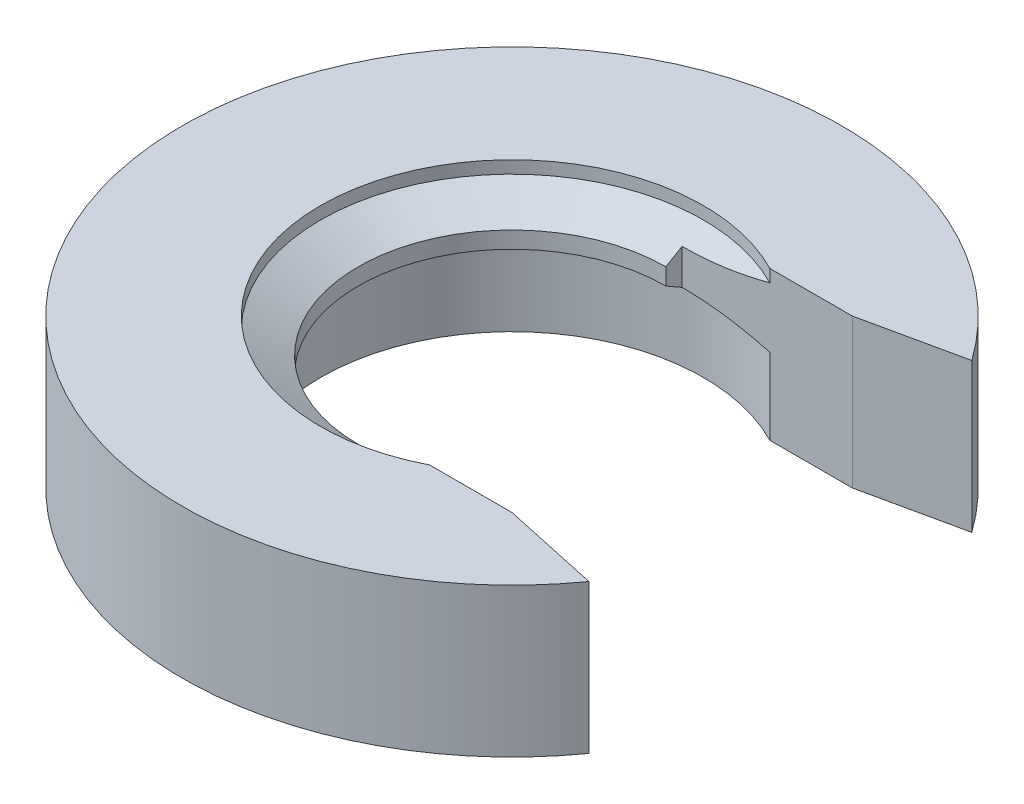
ISO-10303-21;
HEADER;
FILE_DESCRIPTION(('STEP AP214'),'2;1');
FILE_NAME('part.step','',(''),(''),'','','');
FILE_SCHEMA(('AUTOMOTIVE_DESIGN { 1 0 10303 214 1 1 1 1 }'));
ENDSEC;
DATA;
#1=APPLICATION_CONTEXT('core data for automotive mechanical design processes');
#2=APPLICATION_PROTOCOL_DEFINITION('international standard','automotive_design',2000,#1);
#3=PRODUCT_CONTEXT('',#1,'mechanical');
#4=PRODUCT('Part','Part','',(#3));
#5=PRODUCT_RELATED_PRODUCT_CATEGORY('part','',(#4));
#6=PRODUCT_DEFINITION_FORMATION('','',#4);
#7=PRODUCT_DEFINITION_CONTEXT('part definition',#1,'design');
#8=PRODUCT_DEFINITION('design','',#6,#7);
#9=PRODUCT_DEFINITION_SHAPE('','',#8);
#10=(LENGTH_UNIT() NAMED_UNIT(*) SI_UNIT(.MILLI.,.METRE.));
#11=(NAMED_UNIT(*) PLANE_ANGLE_UNIT() SI_UNIT($,.RADIAN.));
#12=(NAMED_UNIT(*) SI_UNIT($,.STERADIAN.) SOLID_ANGLE_UNIT());
#13=UNCERTAINTY_MEASURE_WITH_UNIT(LENGTH_MEASURE(1.E-05),#10,'distance_accuracy_value','');
#14=(GEOMETRIC_REPRESENTATION_CONTEXT(3) GLOBAL_UNCERTAINTY_ASSIGNED_CONTEXT((#13)) GLOBAL_UNIT_ASSIGNED_CONTEXT((#10,
#11,#12)) REPRESENTATION_CONTEXT('',''));
#15=CARTESIAN_POINT('',(0.,0.,0.));
#16=DIRECTION('',(0.,0.,1.));
#17=DIRECTION('',(1.,0.,0.));
#18=AXIS2_PLACEMENT_3D('',#15,#16,#17);
#19=CARTESIAN_POINT('',(0.,10.7834936490571,0.));
#20=DIRECTION('',(0.,1.,0.));
#21=DIRECTION('',(0.,0.,1.));
#22=AXIS2_PLACEMENT_3D('',#19,#20,#21);
#23=CONICAL_SURFACE('',#22,14.4599364905361,1.0471975512);
#24=CARTESIAN_POINT('',(0.,12.8273502691784,0.));
#25=DIRECTION('',(0.,1.,0.));
#26=DIRECTION('',(0.,0.,1.));
#27=AXIS2_PLACEMENT_3D('',#24,#25,#26);
#28=CIRCLE('',#27,18.);
#29=CARTESIAN_POINT('',(8.24621125123533,12.8273502691784,-16.));
#30=VERTEX_POINT('',#29);
#31=CARTESIAN_POINT('',(8.24621125123533,12.8273502691784,16.));
#32=VERTEX_POINT('',#31);
#33=EDGE_CURVE('E158',#30,#32,#28,.T.);
#34=ORIENTED_EDGE('',*,*,#33,.T.);
#35=CARTESIAN_POINT('',(16.7421366401361,15.8053999350849,16.));
#36=CARTESIAN_POINT('',(16.4627198823699,15.6887763855558,16.));
#37=CARTESIAN_POINT('',(16.1828108383827,15.5733336148567,16.));
#38=CARTESIAN_POINT('',(15.6219242010452,15.3450532160892,16.));
#39=CARTESIAN_POINT('',(15.3409465794902,15.2322156573481,16.));
#40=CARTESIAN_POINT('',(14.4961292949801,14.8979150154769,16.));
#41=CARTESIAN_POINT('',(13.9305816734897,14.6807379712502,16.));
#42=CARTESIAN_POINT('',(12.790461278415,14.2587949668925,16.));
#43=CARTESIAN_POINT('',(12.2158532436138,14.0541239245055,16.));
#44=CARTESIAN_POINT('',(11.0608545244695,13.6618646182301,16.));
#45=CARTESIAN_POINT('',(10.4804643527188,13.4742748547585,16.));
#46=CARTESIAN_POINT('',(9.33604492082407,13.1266977182521,16.));
#47=CARTESIAN_POINT('',(8.7722570617951,12.9659206609901,16.));
#48=CARTESIAN_POINT('',(7.63857975493947,12.6672428961332,16.));
#49=CARTESIAN_POINT('',(7.068690116693,12.5293429046971,16.));
#50=CARTESIAN_POINT('',(5.92460230295365,12.2808720224436,16.));
#51=CARTESIAN_POINT('',(5.3504207345792,12.1702254249366,16.));
#52=CARTESIAN_POINT('',(4.19694402244623,11.9798392617871,16.));
#53=CARTESIAN_POINT('',(3.61764949373249,11.9000960291958,16.));
#54=CARTESIAN_POINT('',(2.56136850476196,11.7863836888489,16.));
#55=CARTESIAN_POINT('',(2.08499426921042,11.7467183842786,16.));
#56=CARTESIAN_POINT('',(1.13083592825923,11.691638975909,16.));
#57=CARTESIAN_POINT('',(0.653051859030117,11.6762242552671,16.));
#58=CARTESIAN_POINT('',(-0.303367619513315,11.6701782602402,16.));
#59=CARTESIAN_POINT('',(-0.782003257074148,11.6795830309927,16.));
#60=CARTESIAN_POINT('',(-1.73813967029982,11.7229219458234,16.));
#61=CARTESIAN_POINT('',(-2.21564047087646,11.7568555463637,16.));
#62=CARTESIAN_POINT('',(-3.18291032751171,11.8495115438511,16.));
#63=CARTESIAN_POINT('',(-3.67260938659761,11.908958410317,16.));
#64=CARTESIAN_POINT('',(-4.64873226851278,12.0507869381823,16.));
#65=CARTESIAN_POINT('',(-5.13515549906461,12.1331726386966,16.));
#66=CARTESIAN_POINT('',(-6.10322828511637,12.3183828275526,16.));
#67=CARTESIAN_POINT('',(-6.58488432660522,12.4211737994681,16.));
#68=CARTESIAN_POINT('',(-7.5437381180417,12.644774479305,16.));
#69=CARTESIAN_POINT('',(-8.02093812194409,12.7655744872879,16.));
#70=CARTESIAN_POINT('',(-8.4959253889008,12.8941841425082,16.));
#71=B_SPLINE_CURVE_WITH_KNOTS('',3,(#35,#36,#37,#38,#39,#40,#41,#42,#43,#44,#45,#46,#47,#48,#49,
#50,#51,#52,#53,#54,#55,#56,#57,#58,#59,#60,#61,#62,#63,#64,#65,#66,#67,#68,#69,#70),
.UNSPECIFIED.,.F.,.F.,(4,2,2,2,2,2,2,2,2,2,2,2,2,2,2,2,2,4),(0.,0.908330237140723,
1.81668461807974,3.63396733698278,5.46366433855456,7.2932005539671,9.05159397345678,
10.8100424284614,12.5635495910544,14.3168486212546,15.7503422664533,17.1837994484388,
18.6193395734111,20.0548478890144,21.5341378156514,23.0136883834738,24.490828547721,
25.9671759573711),.UNSPECIFIED.);
#72=CARTESIAN_POINT('',(0.,11.6726497308082,16.));
#73=VERTEX_POINT('',#72);
#74=EDGE_CURVE('E54',#32,#73,#71,.T.);
#75=ORIENTED_EDGE('',*,*,#74,.T.);
#76=DIRECTION('',(0.,-0.499999999997051,-0.866025403786141));
#77=VECTOR('',#76,1.);
#78=CARTESIAN_POINT('',(0.,2.43504542384683,0.));
#79=LINE('',#78,#77);
#80=CARTESIAN_POINT('',(0.,10.7834936490571,14.4599364905361));
#81=VERTEX_POINT('',#80);
#82=EDGE_CURVE('E214',#73,#81,#79,.T.);
#83=ORIENTED_EDGE('',*,*,#82,.T.);
#84=CARTESIAN_POINT('',(0.,10.7834936490571,0.));
#85=DIRECTION('',(0.,1.,0.));
#86=DIRECTION('',(0.,0.,1.));
#87=AXIS2_PLACEMENT_3D('',#84,#85,#86);
#88=CIRCLE('',#87,14.4599364905361);
#89=CARTESIAN_POINT('',(0.,10.7834936490571,-14.4599364905361));
#90=VERTEX_POINT('',#89);
#91=EDGE_CURVE('E149',#90,#81,#88,.T.);
#92=ORIENTED_EDGE('',*,*,#91,.F.);
#93=DIRECTION('',(0.,-0.499999999997051,0.866025403786141));
#94=VECTOR('',#93,1.);
#95=CARTESIAN_POINT('',(0.,2.43504542384683,0.));
#96=LINE('',#95,#94);
#97=CARTESIAN_POINT('',(0.,11.6726497308082,-16.));
#98=VERTEX_POINT('',#97);
#99=EDGE_CURVE('E195',#98,#90,#96,.T.);
#100=ORIENTED_EDGE('',*,*,#99,.F.);
#101=CARTESIAN_POINT('',(16.7421366401361,15.8053999350849,-16.));
#102=CARTESIAN_POINT('',(16.4627198823699,15.6887763855558,-16.));
#103=CARTESIAN_POINT('',(16.1828108383827,15.5733336148567,-16.));
#104=CARTESIAN_POINT('',(15.6219242010452,15.3450532160892,-16.));
#105=CARTESIAN_POINT('',(15.3409465794902,15.2322156573481,-16.));
#106=CARTESIAN_POINT('',(14.4961292949801,14.8979150154769,-16.));
#107=CARTESIAN_POINT('',(13.9305816734897,14.6807379712502,-16.));
#108=CARTESIAN_POINT('',(12.790461278415,14.2587949668925,-16.));
#109=CARTESIAN_POINT('',(12.2158532436138,14.0541239245055,-16.));
#110=CARTESIAN_POINT('',(11.0608545244695,13.6618646182301,-16.));
#111=CARTESIAN_POINT('',(10.4804643527188,13.4742748547585,-16.));
#112=CARTESIAN_POINT('',(9.33604492082407,13.1266977182521,-16.));
#113=CARTESIAN_POINT('',(8.7722570617951,12.9659206609901,-16.));
#114=CARTESIAN_POINT('',(7.63857975493947,12.6672428961332,-16.));
#115=CARTESIAN_POINT('',(7.068690116693,12.5293429046971,-16.));
#116=CARTESIAN_POINT('',(5.92460230295365,12.2808720224436,-16.));
#117=CARTESIAN_POINT('',(5.3504207345792,12.1702254249366,-16.));
#118=CARTESIAN_POINT('',(4.19694402244623,11.9798392617871,-16.));
#119=CARTESIAN_POINT('',(3.61764949373249,11.9000960291958,-16.));
#120=CARTESIAN_POINT('',(2.56136850476196,11.7863836888489,-16.));
#121=CARTESIAN_POINT('',(2.08499426921042,11.7467183842786,-16.));
#122=CARTESIAN_POINT('',(1.13083592825923,11.691638975909,-16.));
#123=CARTESIAN_POINT('',(0.653051859030117,11.6762242552671,-16.));
#124=CARTESIAN_POINT('',(-0.303367619513315,11.6701782602402,-16.));
#125=CARTESIAN_POINT('',(-0.782003257074148,11.6795830309927,-16.));
#126=CARTESIAN_POINT('',(-1.73813967029982,11.7229219458234,-16.));
#127=CARTESIAN_POINT('',(-2.21564047087646,11.7568555463637,-16.));
#128=CARTESIAN_POINT('',(-3.18291032751171,11.8495115438511,-16.));
#129=CARTESIAN_POINT('',(-3.67260938659761,11.908958410317,-16.));
#130=CARTESIAN_POINT('',(-4.64873226851278,12.0507869381823,-16.));
#131=CARTESIAN_POINT('',(-5.13515549906461,12.1331726386966,-16.));
#132=CARTESIAN_POINT('',(-6.10322828511637,12.3183828275526,-16.));
#133=CARTESIAN_POINT('',(-6.58488432660522,12.4211737994681,-16.));
#134=CARTESIAN_POINT('',(-7.5437381180417,12.644774479305,-16.));
#135=CARTESIAN_POINT('',(-8.02093812194409,12.7655744872879,-16.));
#136=CARTESIAN_POINT('',(-8.4959253889008,12.8941841425082,-16.));
#137=B_SPLINE_CURVE_WITH_KNOTS('',3,(#101,#102,#103,#104,#105,#106,#107,#108,#109,#110,#111,
#112,#113,#114,#115,#116,#117,#118,#119,#120,#121,#122,#123,#124,#125,#126,#127,#128,#129,#130,
#131,#132,#133,#134,#135,#136),.UNSPECIFIED.,.F.,.F.,(4,2,2,2,2,2,2,2,2,2,2,2,2,2,2,2,2,4),(0.,
0.908330237140723,1.81668461807974,3.63396733698278,5.46366433855456,7.2932005539671,
9.05159397345678,10.8100424284614,12.5635495910544,14.3168486212546,15.7503422664533,
17.1837994484388,18.6193395734111,20.0548478890144,21.5341378156514,23.0136883834738,
24.490828547721,25.9671759573711),.UNSPECIFIED.);
#138=EDGE_CURVE('E187',#30,#98,#137,.T.);
#139=ORIENTED_EDGE('',*,*,#138,.F.);
#140=EDGE_LOOP('',(#34,#75,#83,#92,#100,#139));
#141=FACE_BOUND('',#140,.T.);
#142=ADVANCED_FACE('F33',(#141),#23,.F.);
#143=CARTESIAN_POINT('',(0.,0.,0.));
#144=DIRECTION('',(0.,1.,0.));
#145=DIRECTION('',(0.,0.,1.));
#146=AXIS2_PLACEMENT_3D('',#143,#144,#145);
#147=CYLINDRICAL_SURFACE('',#146,14.4599364905361);
#148=ORIENTED_EDGE('',*,*,#91,.T.);
#149=DIRECTION('',(0.,1.,0.));
#150=VECTOR('',#149,1.);
#151=CARTESIAN_POINT('',(0.,4.,14.4599364905361));
#152=LINE('',#151,#150);
#153=CARTESIAN_POINT('',(0.,9.21650635094293,14.4599364905361));
#154=VERTEX_POINT('',#153);
#155=EDGE_CURVE('E273',#154,#81,#152,.T.);
#156=ORIENTED_EDGE('',*,*,#155,.F.);
#157=CARTESIAN_POINT('',(0.,9.21650635094293,0.));
#158=DIRECTION('',(0.,1.,0.));
#159=DIRECTION('',(0.,0.,1.));
#160=AXIS2_PLACEMENT_3D('',#157,#158,#159);
#161=CIRCLE('',#160,14.4599364905361);
#162=CARTESIAN_POINT('',(0.,9.21650635094293,-14.4599364905361));
#163=VERTEX_POINT('',#162);
#164=EDGE_CURVE('E146',#163,#154,#161,.T.);
#165=ORIENTED_EDGE('',*,*,#164,.F.);
#166=DIRECTION('',(0.,1.,0.));
#167=VECTOR('',#166,1.);
#168=CARTESIAN_POINT('',(0.,4.,-14.4599364905361));
#169=LINE('',#168,#167);
#170=EDGE_CURVE('E271',#163,#90,#169,.T.);
#171=ORIENTED_EDGE('',*,*,#170,.T.);
#172=EDGE_LOOP('',(#148,#156,#165,#171));
#173=FACE_BOUND('',#172,.T.);
#174=ADVANCED_FACE('F203',(#173),#147,.F.);
#175=CARTESIAN_POINT('',(0.,7.17264973082163,0.));
#176=DIRECTION('',(0.,-1.,0.));
#177=DIRECTION('',(0.,0.,-1.));
#178=AXIS2_PLACEMENT_3D('',#175,#176,#177);
#179=CONICAL_SURFACE('',#178,18.,1.0471975512);
#180=DIRECTION('',(0.,-0.499999999997053,0.86602540378614));
#181=VECTOR('',#180,1.);
#182=CARTESIAN_POINT('',(0.,17.5649545761532,0.));
#183=LINE('',#182,#181);
#184=CARTESIAN_POINT('',(0.,8.32735026919181,16.));
#185=VERTEX_POINT('',#184);
#186=EDGE_CURVE('E47',#154,#185,#183,.T.);
#187=ORIENTED_EDGE('',*,*,#186,.T.);
#188=CARTESIAN_POINT('',(-8.49592538890081,7.10581585749174,16.));
#189=CARTESIAN_POINT('',(-8.09690939574199,7.21385289300388,16.));
#190=CARTESIAN_POINT('',(-7.69635268901176,7.31637667868806,16.));
#191=CARTESIAN_POINT('',(-6.89213404243225,7.5089849939576,16.));
#192=CARTESIAN_POINT('',(-6.48847116770772,7.59906561046408,16.));
#193=CARTESIAN_POINT('',(-5.67757581864169,7.76544701994416,16.));
#194=CARTESIAN_POINT('',(-5.27033842951811,7.84172404313542,16.));
#195=CARTESIAN_POINT('',(-4.45330134011808,7.97886809774038,16.));
#196=CARTESIAN_POINT('',(-4.04350188684956,8.03973659190778,16.));
#197=CARTESIAN_POINT('',(-3.22894122360501,8.14385912374282,16.));
#198=CARTESIAN_POINT('',(-2.82421725026115,8.18740261493429,16.));
#199=CARTESIAN_POINT('',(-2.01327729266845,8.25738452869872,16.));
#200=CARTESIAN_POINT('',(-1.60706129068033,8.28382274723427,16.));
#201=CARTESIAN_POINT('',(-0.794200090321482,8.31893465427267,16.));
#202=CARTESIAN_POINT('',(-0.387555545781879,8.32762335257728,16.));
#203=CARTESIAN_POINT('',(0.425721705841447,8.32706404517934,16.));
#204=CARTESIAN_POINT('',(0.832354412805092,8.31781589661694,16.));
#205=CARTESIAN_POINT('',(1.68437915739489,8.27984746533722,16.));
#206=CARTESIAN_POINT('',(2.12969105232633,8.24931934811974,16.));
#207=CARTESIAN_POINT('',(3.01843347582944,8.16782066886336,16.));
#208=CARTESIAN_POINT('',(3.46186394291743,8.11684944387971,16.));
#209=CARTESIAN_POINT('',(4.34634836670417,7.99580281447566,16.));
#210=CARTESIAN_POINT('',(4.78740084358595,7.92571666202914,16.));
#211=CARTESIAN_POINT('',(5.66639776363937,7.76812717093512,16.));
#212=CARTESIAN_POINT('',(6.10434183219297,7.68062176867075,16.));
#213=CARTESIAN_POINT('',(7.41782581324197,7.39368115127104,16.));
#214=CARTESIAN_POINT('',(8.28824163846323,7.17051173345001,16.));
#215=CARTESIAN_POINT('',(9.58295524256995,6.79937948897119,16.));
#216=CARTESIAN_POINT('',(10.0126886662702,6.66961249395323,16.));
#217=CARTESIAN_POINT('',(10.8688302365707,6.39948803259342,16.));
#218=CARTESIAN_POINT('',(11.2952384276278,6.25913070810837,16.));
#219=CARTESIAN_POINT('',(12.145810400462,5.96893885601789,16.));
#220=CARTESIAN_POINT('',(12.5699674812677,5.8190848098008,16.));
#221=CARTESIAN_POINT('',(13.4153684327684,5.5114008023054,16.));
#222=CARTESIAN_POINT('',(13.836612337397,5.35357093411057,16.));
#223=CARTESIAN_POINT('',(14.6732474603835,5.03223385746154,16.));
#224=CARTESIAN_POINT('',(15.0886588262479,4.86877894029629,16.));
#225=CARTESIAN_POINT('',(15.917116491908,4.53592789283181,16.));
#226=CARTESIAN_POINT('',(16.3301626943899,4.36653152008807,16.));
#227=CARTESIAN_POINT('',(16.7421366401361,4.19460006491507,16.));
#228=B_SPLINE_CURVE_WITH_KNOTS('',3,(#188,#189,#190,#191,#192,#193,#194,#195,#196,#197,#198,
#199,#200,#201,#202,#203,#204,#205,#206,#207,#208,#209,#210,#211,#212,#213,#214,#215,#216,#217,
#218,#219,#220,#221,#222,#223,#224,#225,#226,#227),.UNSPECIFIED.,.F.,.F.,(4,2,2,2,2,2,2,2,2,2,2,
2,2,2,2,2,2,2,2,4),(0.,1.24017939997166,2.48074792308346,3.72343278824481,4.96599963927795,
6.18683428831984,7.40768349961647,8.62749987719181,9.84732597015926,11.1858929631212,
12.5245033676689,13.8638680093226,15.2033914168332,17.896878829604,19.2434992543404,
20.5901016443799,21.9395675897625,23.2890177895576,24.6282076150601,25.967452150695),.UNSPECIFIED.);
#229=CARTESIAN_POINT('',(8.24621125123533,7.17264973082163,16.));
#230=VERTEX_POINT('',#229);
#231=EDGE_CURVE('E11',#185,#230,#228,.T.);
#232=ORIENTED_EDGE('',*,*,#231,.T.);
#233=CARTESIAN_POINT('',(0.,7.17264973082163,0.));
#234=DIRECTION('',(0.,1.,0.));
#235=DIRECTION('',(0.,0.,1.));
#236=AXIS2_PLACEMENT_3D('',#233,#234,#235);
#237=CIRCLE('',#236,18.);
#238=CARTESIAN_POINT('',(8.24621125123533,7.17264973082163,-16.));
#239=VERTEX_POINT('',#238);
#240=EDGE_CURVE('E143',#239,#230,#237,.T.);
#241=ORIENTED_EDGE('',*,*,#240,.F.);
#242=CARTESIAN_POINT('',(-8.49592538890081,7.10581585749174,-16.));
#243=CARTESIAN_POINT('',(-8.09690939574199,7.21385289300388,-16.));
#244=CARTESIAN_POINT('',(-7.69635268901176,7.31637667868806,-16.));
#245=CARTESIAN_POINT('',(-6.89213404243225,7.5089849939576,-16.));
#246=CARTESIAN_POINT('',(-6.48847116770772,7.59906561046408,-16.));
#247=CARTESIAN_POINT('',(-5.67757581864169,7.76544701994416,-16.));
#248=CARTESIAN_POINT('',(-5.27033842951811,7.84172404313542,-16.));
#249=CARTESIAN_POINT('',(-4.45330134011808,7.97886809774038,-16.));
#250=CARTESIAN_POINT('',(-4.04350188684956,8.03973659190778,-16.));
#251=CARTESIAN_POINT('',(-3.22894122360501,8.14385912374282,-16.));
#252=CARTESIAN_POINT('',(-2.82421725026115,8.18740261493429,-16.));
#253=CARTESIAN_POINT('',(-2.01327729266845,8.25738452869872,-16.));
#254=CARTESIAN_POINT('',(-1.60706129068033,8.28382274723427,-16.));
#255=CARTESIAN_POINT('',(-0.794200090321482,8.31893465427267,-16.));
#256=CARTESIAN_POINT('',(-0.387555545781879,8.32762335257728,-16.));
#257=CARTESIAN_POINT('',(0.425721705841447,8.32706404517934,-16.));
#258=CARTESIAN_POINT('',(0.832354412805092,8.31781589661694,-16.));
#259=CARTESIAN_POINT('',(1.68437915739489,8.27984746533722,-16.));
#260=CARTESIAN_POINT('',(2.12969105232633,8.24931934811974,-16.));
#261=CARTESIAN_POINT('',(3.01843347582944,8.16782066886336,-16.));
#262=CARTESIAN_POINT('',(3.46186394291743,8.11684944387971,-16.));
#263=CARTESIAN_POINT('',(4.34634836670417,7.99580281447566,-16.));
#264=CARTESIAN_POINT('',(4.78740084358595,7.92571666202914,-16.));
#265=CARTESIAN_POINT('',(5.66639776363937,7.76812717093512,-16.));
#266=CARTESIAN_POINT('',(6.10434183219297,7.68062176867075,-16.));
#267=CARTESIAN_POINT('',(7.41782581324197,7.39368115127104,-16.));
#268=CARTESIAN_POINT('',(8.28824163846323,7.17051173345001,-16.));
#269=CARTESIAN_POINT('',(9.58295524256995,6.79937948897119,-16.));
#270=CARTESIAN_POINT('',(10.0126886662702,6.66961249395323,-16.));
#271=CARTESIAN_POINT('',(10.8688302365707,6.39948803259342,-16.));
#272=CARTESIAN_POINT('',(11.2952384276278,6.25913070810837,-16.));
#273=CARTESIAN_POINT('',(12.145810400462,5.96893885601789,-16.));
#274=CARTESIAN_POINT('',(12.5699674812677,5.8190848098008,-16.));
#275=CARTESIAN_POINT('',(13.4153684327684,5.5114008023054,-16.));
#276=CARTESIAN_POINT('',(13.836612337397,5.35357093411057,-16.));
#277=CARTESIAN_POINT('',(14.6732474603835,5.03223385746154,-16.));
#278=CARTESIAN_POINT('',(15.0886588262479,4.86877894029629,-16.));
#279=CARTESIAN_POINT('',(15.917116491908,4.53592789283181,-16.));
#280=CARTESIAN_POINT('',(16.3301626943899,4.36653152008807,-16.));
#281=CARTESIAN_POINT('',(16.7421366401361,4.19460006491507,-16.));
#282=B_SPLINE_CURVE_WITH_KNOTS('',3,(#242,#243,#244,#245,#246,#247,#248,#249,#250,#251,#252,
#253,#254,#255,#256,#257,#258,#259,#260,#261,#262,#263,#264,#265,#266,#267,#268,#269,#270,#271,
#272,#273,#274,#275,#276,#277,#278,#279,#280,#281),.UNSPECIFIED.,.F.,.F.,(4,2,2,2,2,2,2,2,2,2,2,
2,2,2,2,2,2,2,2,4),(0.,1.24017939997166,2.48074792308346,3.72343278824481,4.96599963927795,
6.18683428831984,7.40768349961647,8.62749987719181,9.84732597015926,11.1858929631212,
12.5245033676689,13.8638680093226,15.2033914168332,17.896878829604,19.2434992543404,
20.5901016443799,21.9395675897625,23.2890177895576,24.6282076150601,25.967452150695),.UNSPECIFIED.);
#283=CARTESIAN_POINT('',(0.,8.32735026919181,-16.));
#284=VERTEX_POINT('',#283);
#285=EDGE_CURVE('E167',#284,#239,#282,.T.);
#286=ORIENTED_EDGE('',*,*,#285,.F.);
#287=DIRECTION('',(0.,-0.499999999997053,-0.86602540378614));
#288=VECTOR('',#287,1.);
#289=CARTESIAN_POINT('',(0.,17.5649545761532,0.));
#290=LINE('',#289,#288);
#291=EDGE_CURVE('E175',#163,#284,#290,.T.);
#292=ORIENTED_EDGE('',*,*,#291,.F.);
#293=ORIENTED_EDGE('',*,*,#164,.T.);
#294=EDGE_LOOP('',(#187,#232,#241,#286,#292,#293));
#295=FACE_BOUND('',#294,.T.);
#296=ADVANCED_FACE('F141',(#295),#179,.F.);
#297=CARTESIAN_POINT('',(0.,14.,0.));
#298=DIRECTION('',(0.,-1.,0.));
#299=DIRECTION('',(0.,0.,-1.));
#300=AXIS2_PLACEMENT_3D('',#297,#298,#299);
#301=CYLINDRICAL_SURFACE('',#300,18.);
#302=ORIENTED_EDGE('',*,*,#33,.F.);
#303=DIRECTION('',(0.,1.,0.));
#304=VECTOR('',#303,1.);
#305=CARTESIAN_POINT('',(8.24621125123533,-29.3598365118064,-16.));
#306=LINE('',#305,#304);
#307=CARTESIAN_POINT('',(8.24621125123533,14.,-16.));
#308=VERTEX_POINT('',#307);
#309=EDGE_CURVE('E236',#30,#308,#306,.T.);
#310=ORIENTED_EDGE('',*,*,#309,.T.);
#311=CARTESIAN_POINT('',(0.,14.,0.));
#312=DIRECTION('',(0.,1.,0.));
#313=DIRECTION('',(0.,0.,1.));
#314=AXIS2_PLACEMENT_3D('',#311,#312,#313);
#315=CIRCLE('',#314,18.);
#316=CARTESIAN_POINT('',(8.24621125123533,14.,16.));
#317=VERTEX_POINT('',#316);
#318=EDGE_CURVE('E161',#308,#317,#315,.T.);
#319=ORIENTED_EDGE('',*,*,#318,.T.);
#320=DIRECTION('',(0.,1.,0.));
#321=VECTOR('',#320,1.);
#322=CARTESIAN_POINT('',(8.24621125123533,-29.3598365118064,16.));
#323=LINE('',#322,#321);
#324=EDGE_CURVE('E136',#32,#317,#323,.T.);
#325=ORIENTED_EDGE('',*,*,#324,.F.);
#326=EDGE_LOOP('',(#302,#310,#319,#325));
#327=FACE_BOUND('',#326,.T.);
#328=ADVANCED_FACE('F245',(#327),#301,.F.);
#329=CARTESIAN_POINT('',(0.,14.,0.));
#330=DIRECTION('',(0.,1.,0.));
#331=DIRECTION('',(0.,0.,1.));
#332=AXIS2_PLACEMENT_3D('',#329,#330,#331);
#333=PLANE('',#332);
#334=ORIENTED_EDGE('',*,*,#318,.F.);
#335=DIRECTION('',(1.,0.,0.));
#336=VECTOR('',#335,1.);
#337=CARTESIAN_POINT('',(0.,14.,-16.));
#338=LINE('',#337,#336);
#339=CARTESIAN_POINT('',(16.,14.,-16.));
#340=VERTEX_POINT('',#339);
#341=EDGE_CURVE('E216',#308,#340,#338,.T.);
#342=ORIENTED_EDGE('',*,*,#341,.T.);
#343=DIRECTION('',(0.977361497331419,0.,-0.211576235749877));
#344=VECTOR('',#343,1.);
#345=CARTESIAN_POINT('',(-2.59235140861052,14.,-11.9751844782987));
#346=LINE('',#345,#344);
#347=CARTESIAN_POINT('',(25.2388589282479,14.,-18.));
#348=VERTEX_POINT('',#347);
#349=EDGE_CURVE('E233',#340,#348,#346,.T.);
#350=ORIENTED_EDGE('',*,*,#349,.T.);
#351=CARTESIAN_POINT('',(0.,14.,0.));
#352=DIRECTION('',(0.,1.,0.));
#353=DIRECTION('',(0.,0.,1.));
#354=AXIS2_PLACEMENT_3D('',#351,#352,#353);
#355=CIRCLE('',#354,31.);
#356=CARTESIAN_POINT('',(25.2388589282479,14.,18.));
#357=VERTEX_POINT('',#356);
#358=EDGE_CURVE('E165',#348,#357,#355,.T.);
#359=ORIENTED_EDGE('',*,*,#358,.T.);
#360=DIRECTION('',(0.977361497331419,0.,0.211576235749877));
#361=VECTOR('',#360,1.);
#362=CARTESIAN_POINT('',(-2.59235140861052,14.,11.9751844782987));
#363=LINE('',#362,#361);
#364=CARTESIAN_POINT('',(16.,14.,16.));
#365=VERTEX_POINT('',#364);
#366=EDGE_CURVE('E213',#365,#357,#363,.T.);
#367=ORIENTED_EDGE('',*,*,#366,.F.);
#368=DIRECTION('',(1.,0.,0.));
#369=VECTOR('',#368,1.);
#370=CARTESIAN_POINT('',(0.,14.,16.));
#371=LINE('',#370,#369);
#372=EDGE_CURVE('E219',#317,#365,#371,.T.);
#373=ORIENTED_EDGE('',*,*,#372,.F.);
#374=EDGE_LOOP('',(#334,#342,#350,#359,#367,#373));
#375=FACE_BOUND('',#374,.T.);
#376=ADVANCED_FACE('F253',(#375),#333,.T.);
#377=CARTESIAN_POINT('',(0.,0.,0.));
#378=DIRECTION('',(0.,1.,0.));
#379=DIRECTION('',(0.,0.,1.));
#380=AXIS2_PLACEMENT_3D('',#377,#378,#379);
#381=PLANE('',#380);
#382=CARTESIAN_POINT('',(0.,0.,0.));
#383=DIRECTION('',(0.,1.,0.));
#384=DIRECTION('',(0.,0.,1.));
#385=AXIS2_PLACEMENT_3D('',#382,#383,#384);
#386=CIRCLE('',#385,31.);
#387=CARTESIAN_POINT('',(25.2388589282479,0.,-18.));
#388=VERTEX_POINT('',#387);
#389=CARTESIAN_POINT('',(25.2388589282479,0.,18.));
#390=VERTEX_POINT('',#389);
#391=EDGE_CURVE('E163',#388,#390,#386,.T.);
#392=ORIENTED_EDGE('',*,*,#391,.F.);
#393=DIRECTION('',(-0.977361497331419,0.,0.211576235749877));
#394=VECTOR('',#393,1.);
#395=CARTESIAN_POINT('',(-2.59235140861052,0.,-11.9751844782987));
#396=LINE('',#395,#394);
#397=CARTESIAN_POINT('',(16.,0.,-16.));
#398=VERTEX_POINT('',#397);
#399=EDGE_CURVE('E152',#388,#398,#396,.T.);
#400=ORIENTED_EDGE('',*,*,#399,.T.);
#401=DIRECTION('',(-1.,0.,0.));
#402=VECTOR('',#401,1.);
#403=CARTESIAN_POINT('',(0.,0.,-16.));
#404=LINE('',#403,#402);
#405=CARTESIAN_POINT('',(8.24621125123533,0.,-16.));
#406=VERTEX_POINT('',#405);
#407=EDGE_CURVE('E147',#398,#406,#404,.T.);
#408=ORIENTED_EDGE('',*,*,#407,.T.);
#409=CARTESIAN_POINT('',(0.,0.,0.));
#410=DIRECTION('',(0.,1.,0.));
#411=DIRECTION('',(0.,0.,1.));
#412=AXIS2_PLACEMENT_3D('',#409,#410,#411);
#413=CIRCLE('',#412,18.);
#414=CARTESIAN_POINT('',(8.24621125123533,0.,16.));
#415=VERTEX_POINT('',#414);
#416=EDGE_CURVE('E160',#406,#415,#413,.T.);
#417=ORIENTED_EDGE('',*,*,#416,.T.);
#418=DIRECTION('',(-1.,0.,0.));
#419=VECTOR('',#418,1.);
#420=CARTESIAN_POINT('',(0.,0.,16.));
#421=LINE('',#420,#419);
#422=CARTESIAN_POINT('',(16.,0.,16.));
#423=VERTEX_POINT('',#422);
#424=EDGE_CURVE('E134',#423,#415,#421,.T.);
#425=ORIENTED_EDGE('',*,*,#424,.F.);
#426=DIRECTION('',(-0.977361497331419,0.,-0.211576235749877));
#427=VECTOR('',#426,1.);
#428=CARTESIAN_POINT('',(-2.59235140861052,0.,11.9751844782987));
#429=LINE('',#428,#427);
#430=EDGE_CURVE('E135',#390,#423,#429,.T.);
#431=ORIENTED_EDGE('',*,*,#430,.F.);
#432=EDGE_LOOP('',(#392,#400,#408,#417,#425,#431));
#433=FACE_BOUND('',#432,.T.);
#434=ADVANCED_FACE('F261',(#433),#381,.F.);
#435=CARTESIAN_POINT('',(0.,14.,0.));
#436=DIRECTION('',(0.,-1.,0.));
#437=DIRECTION('',(0.,0.,-1.));
#438=AXIS2_PLACEMENT_3D('',#435,#436,#437);
#439=CYLINDRICAL_SURFACE('',#438,31.);
#440=ORIENTED_EDGE('',*,*,#358,.F.);
#441=DIRECTION('',(0.,1.,0.));
#442=VECTOR('',#441,1.);
#443=CARTESIAN_POINT('',(25.2388589282479,-29.3598365118064,-18.));
#444=LINE('',#443,#442);
#445=EDGE_CURVE('E230',#388,#348,#444,.T.);
#446=ORIENTED_EDGE('',*,*,#445,.F.);
#447=ORIENTED_EDGE('',*,*,#391,.T.);
#448=DIRECTION('',(0.,1.,0.));
#449=VECTOR('',#448,1.);
#450=CARTESIAN_POINT('',(25.2388589282479,-29.3598365118064,18.));
#451=LINE('',#450,#449);
#452=EDGE_CURVE('E221',#390,#357,#451,.T.);
#453=ORIENTED_EDGE('',*,*,#452,.T.);
#454=EDGE_LOOP('',(#440,#446,#447,#453));
#455=FACE_BOUND('',#454,.T.);
#456=ADVANCED_FACE('F35',(#455),#439,.T.);
#457=EDGE_CURVE('E62',#406,#239,#306,.T.);
#458=ORIENTED_EDGE('',*,*,#457,.T.);
#459=ORIENTED_EDGE('',*,*,#240,.T.);
#460=EDGE_CURVE('E130',#415,#230,#323,.T.);
#461=ORIENTED_EDGE('',*,*,#460,.F.);
#462=ORIENTED_EDGE('',*,*,#416,.F.);
#463=EDGE_LOOP('',(#458,#459,#461,#462));
#464=FACE_BOUND('',#463,.T.);
#465=ADVANCED_FACE('F145',(#464),#301,.F.);
#466=CARTESIAN_POINT('',(-2.59235140861052,-29.3598365118064,-11.9751844782987));
#467=DIRECTION('',(0.211576235749877,0.,0.977361497331419));
#468=DIRECTION('',(0.977361497331419,0.,-0.211576235749877));
#469=AXIS2_PLACEMENT_3D('',#466,#467,#468);
#470=PLANE('',#469);
#471=ORIENTED_EDGE('',*,*,#399,.F.);
#472=ORIENTED_EDGE('',*,*,#445,.T.);
#473=ORIENTED_EDGE('',*,*,#349,.F.);
#474=DIRECTION('',(0.,1.,0.));
#475=VECTOR('',#474,1.);
#476=CARTESIAN_POINT('',(16.,-29.3598365118064,-16.));
#477=LINE('',#476,#475);
#478=EDGE_CURVE('E239',#398,#340,#477,.T.);
#479=ORIENTED_EDGE('',*,*,#478,.F.);
#480=EDGE_LOOP('',(#471,#472,#473,#479));
#481=FACE_BOUND('',#480,.T.);
#482=ADVANCED_FACE('F290',(#481),#470,.T.);
#483=CARTESIAN_POINT('',(0.,-29.3598365118064,-16.));
#484=DIRECTION('',(0.,0.,1.));
#485=DIRECTION('',(1.,0.,0.));
#486=AXIS2_PLACEMENT_3D('',#483,#484,#485);
#487=PLANE('',#486);
#488=ORIENTED_EDGE('',*,*,#407,.F.);
#489=ORIENTED_EDGE('',*,*,#478,.T.);
#490=ORIENTED_EDGE('',*,*,#341,.F.);
#491=ORIENTED_EDGE('',*,*,#309,.F.);
#492=ORIENTED_EDGE('',*,*,#138,.T.);
#493=DIRECTION('',(0.,1.,0.));
#494=VECTOR('',#493,1.);
#495=CARTESIAN_POINT('',(0.,4.,-16.));
#496=LINE('',#495,#494);
#497=EDGE_CURVE('E197',#284,#98,#496,.T.);
#498=ORIENTED_EDGE('',*,*,#497,.F.);
#499=ORIENTED_EDGE('',*,*,#285,.T.);
#500=ORIENTED_EDGE('',*,*,#457,.F.);
#501=EDGE_LOOP('',(#488,#489,#490,#491,#492,#498,#499,#500));
#502=FACE_BOUND('',#501,.T.);
#503=ADVANCED_FACE('F249',(#502),#487,.T.);
#504=CARTESIAN_POINT('',(-2.59235140861052,-29.3598365118064,11.9751844782987));
#505=DIRECTION('',(-0.211576235749877,0.,0.977361497331419));
#506=DIRECTION('',(0.977361497331419,0.,0.211576235749877));
#507=AXIS2_PLACEMENT_3D('',#504,#505,#506);
#508=PLANE('',#507);
#509=ORIENTED_EDGE('',*,*,#452,.F.);
#510=ORIENTED_EDGE('',*,*,#430,.T.);
#511=DIRECTION('',(0.,1.,0.));
#512=VECTOR('',#511,1.);
#513=CARTESIAN_POINT('',(16.,-29.3598365118064,16.));
#514=LINE('',#513,#512);
#515=EDGE_CURVE('E223',#423,#365,#514,.T.);
#516=ORIENTED_EDGE('',*,*,#515,.T.);
#517=ORIENTED_EDGE('',*,*,#366,.T.);
#518=EDGE_LOOP('',(#509,#510,#516,#517));
#519=FACE_BOUND('',#518,.T.);
#520=ADVANCED_FACE('F259',(#519),#508,.F.);
#521=CARTESIAN_POINT('',(0.,-29.3598365118064,16.));
#522=DIRECTION('',(0.,0.,1.));
#523=DIRECTION('',(1.,0.,0.));
#524=AXIS2_PLACEMENT_3D('',#521,#522,#523);
#525=PLANE('',#524);
#526=ORIENTED_EDGE('',*,*,#515,.F.);
#527=ORIENTED_EDGE('',*,*,#424,.T.);
#528=ORIENTED_EDGE('',*,*,#460,.T.);
#529=ORIENTED_EDGE('',*,*,#231,.F.);
#530=DIRECTION('',(0.,1.,0.));
#531=VECTOR('',#530,1.);
#532=CARTESIAN_POINT('',(0.,4.,16.));
#533=LINE('',#532,#531);
#534=EDGE_CURVE('E196',#185,#73,#533,.T.);
#535=ORIENTED_EDGE('',*,*,#534,.T.);
#536=ORIENTED_EDGE('',*,*,#74,.F.);
#537=ORIENTED_EDGE('',*,*,#324,.T.);
#538=ORIENTED_EDGE('',*,*,#372,.T.);
#539=EDGE_LOOP('',(#526,#527,#528,#529,#535,#536,#537,#538));
#540=FACE_BOUND('',#539,.T.);
#541=ADVANCED_FACE('F132',(#540),#525,.F.);
#542=CARTESIAN_POINT('',(0.,4.,0.));
#543=DIRECTION('',(1.,0.,0.));
#544=DIRECTION('',(0.,0.,-1.));
#545=AXIS2_PLACEMENT_3D('',#542,#543,#544);
#546=PLANE('',#545);
#547=ORIENTED_EDGE('',*,*,#534,.F.);
#548=ORIENTED_EDGE('',*,*,#186,.F.);
#549=ORIENTED_EDGE('',*,*,#155,.T.);
#550=ORIENTED_EDGE('',*,*,#82,.F.);
#551=EDGE_LOOP('',(#547,#548,#549,#550));
#552=FACE_BOUND('',#551,.T.);
#553=ADVANCED_FACE('F279',(#552),#546,.T.);
#554=CARTESIAN_POINT('',(0.,4.,0.));
#555=DIRECTION('',(-1.,0.,0.));
#556=DIRECTION('',(0.,0.,1.));
#557=AXIS2_PLACEMENT_3D('',#554,#555,#556);
#558=PLANE('',#557);
#559=ORIENTED_EDGE('',*,*,#99,.T.);
#560=ORIENTED_EDGE('',*,*,#170,.F.);
#561=ORIENTED_EDGE('',*,*,#291,.T.);
#562=ORIENTED_EDGE('',*,*,#497,.T.);
#563=EDGE_LOOP('',(#559,#560,#561,#562));
#564=FACE_BOUND('',#563,.T.);
#565=ADVANCED_FACE('F181',(#564),#558,.F.);
#566=CLOSED_SHELL('',(#142,#174,#296,#328,#376,#434,#456,#465,#482,#503,#520,#541,#553,#565));
#567=MANIFOLD_SOLID_BREP('B2',#566);
#568=ADVANCED_BREP_SHAPE_REPRESENTATION('',(#18,#567),#14);
#569=SHAPE_DEFINITION_REPRESENTATION(#9,#568);
ENDSEC;
END-ISO-10303-21;
